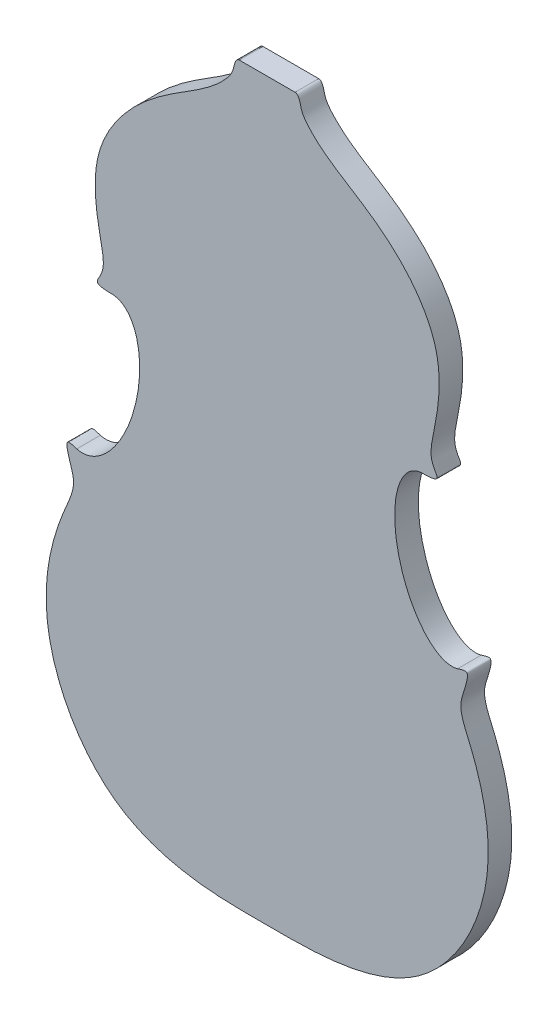
ISO-10303-21;
HEADER;
FILE_DESCRIPTION(('STEP AP214'),'2;1');
FILE_NAME('part.step','',(''),(''),'','','');
FILE_SCHEMA(('AUTOMOTIVE_DESIGN { 1 0 10303 214 1 1 1 1 }'));
ENDSEC;
DATA;
#1=APPLICATION_CONTEXT('core data for automotive mechanical design processes');
#2=APPLICATION_PROTOCOL_DEFINITION('international standard','automotive_design',2000,#1);
#3=PRODUCT_CONTEXT('',#1,'mechanical');
#4=PRODUCT('Part','Part','',(#3));
#5=PRODUCT_RELATED_PRODUCT_CATEGORY('part','',(#4));
#6=PRODUCT_DEFINITION_FORMATION('','',#4);
#7=PRODUCT_DEFINITION_CONTEXT('part definition',#1,'design');
#8=PRODUCT_DEFINITION('design','',#6,#7);
#9=PRODUCT_DEFINITION_SHAPE('','',#8);
#10=(LENGTH_UNIT() NAMED_UNIT(*) SI_UNIT(.MILLI.,.METRE.));
#11=(NAMED_UNIT(*) PLANE_ANGLE_UNIT() SI_UNIT($,.RADIAN.));
#12=(NAMED_UNIT(*) SI_UNIT($,.STERADIAN.) SOLID_ANGLE_UNIT());
#13=UNCERTAINTY_MEASURE_WITH_UNIT(LENGTH_MEASURE(1.E-05),#10,'distance_accuracy_value','');
#14=(GEOMETRIC_REPRESENTATION_CONTEXT(3) GLOBAL_UNCERTAINTY_ASSIGNED_CONTEXT((#13)) GLOBAL_UNIT_ASSIGNED_CONTEXT((#10,
#11,#12)) REPRESENTATION_CONTEXT('',''));
#15=CARTESIAN_POINT('',(0.,0.,0.));
#16=DIRECTION('',(0.,0.,1.));
#17=DIRECTION('',(1.,0.,0.));
#18=AXIS2_PLACEMENT_3D('',#15,#16,#17);
#19=CARTESIAN_POINT('',(0.,489.229569362631,-33.528));
#20=DIRECTION('',(0.,-1.,0.));
#21=DIRECTION('',(1.,0.,0.));
#22=AXIS2_PLACEMENT_3D('',#19,#20,#21);
#23=PLANE('',#22);
#24=DIRECTION('',(1.,0.,0.));
#25=VECTOR('',#24,1.);
#26=CARTESIAN_POINT('',(0.,489.229569362631,0.));
#27=LINE('',#26,#25);
#28=CARTESIAN_POINT('',(-39.526005163562,489.229569362631,0.));
#29=VERTEX_POINT('',#28);
#30=CARTESIAN_POINT('',(39.526005163562,489.229569362631,0.));
#31=VERTEX_POINT('',#30);
#32=EDGE_CURVE('E130',#29,#31,#27,.T.);
#33=ORIENTED_EDGE('',*,*,#32,.T.);
#34=DIRECTION('',(0.,0.,1.));
#35=VECTOR('',#34,1.);
#36=CARTESIAN_POINT('',(39.526005163562,489.229569362631,-33.528));
#37=LINE('',#36,#35);
#38=CARTESIAN_POINT('',(39.526005163562,489.229569362631,-33.528));
#39=VERTEX_POINT('',#38);
#40=EDGE_CURVE('E11',#39,#31,#37,.T.);
#41=ORIENTED_EDGE('',*,*,#40,.F.);
#42=DIRECTION('',(1.,0.,0.));
#43=VECTOR('',#42,1.);
#44=CARTESIAN_POINT('',(0.,489.229569362631,-33.528));
#45=LINE('',#44,#43);
#46=CARTESIAN_POINT('',(-39.526005163562,489.229569362631,-33.528));
#47=VERTEX_POINT('',#46);
#48=EDGE_CURVE('E109',#47,#39,#45,.T.);
#49=ORIENTED_EDGE('',*,*,#48,.F.);
#50=DIRECTION('',(0.,0.,1.));
#51=VECTOR('',#50,1.);
#52=CARTESIAN_POINT('',(-39.526005163562,489.229569362631,-33.528));
#53=LINE('',#52,#51);
#54=EDGE_CURVE('E113',#47,#29,#53,.T.);
#55=ORIENTED_EDGE('',*,*,#54,.T.);
#56=EDGE_LOOP('',(#33,#41,#49,#55));
#57=FACE_BOUND('',#56,.T.);
#58=ADVANCED_FACE('F43',(#57),#23,.F.);
#59=CARTESIAN_POINT('',(39.526005163562,489.229569362631,-33.528));
#60=CARTESIAN_POINT('',(41.9941658820631,489.229569362631,-33.528));
#61=CARTESIAN_POINT('',(46.5804579159214,483.708971038662,-33.528));
#62=CARTESIAN_POINT('',(47.7623184287525,469.539805459463,-33.528));
#63=CARTESIAN_POINT('',(74.7703472572244,435.758695832475,-33.528));
#64=CARTESIAN_POINT('',(127.346779032883,407.129221149891,-33.528));
#65=CARTESIAN_POINT('',(196.147624771227,356.264111053545,-33.528));
#66=CARTESIAN_POINT('',(250.121842796438,278.719817652429,-33.528));
#67=CARTESIAN_POINT('',(243.796963910234,200.259757547331,-33.528));
#68=CARTESIAN_POINT('',(231.400647678077,148.667774360726,-33.528));
#69=CARTESIAN_POINT('',(233.206586123207,129.473919564613,-33.528));
#70=CARTESIAN_POINT('',(246.106067892617,111.456905789366,-33.528));
#71=CARTESIAN_POINT('',(223.550549609283,111.0134777671,-33.528));
#72=CARTESIAN_POINT('',(219.991214235242,111.047612515758,-33.528));
#73=B_SPLINE_CURVE_WITH_KNOTS('',3,(#59,#60,#61,#62,#63,#64,#65,#66,#67,#68,#69,#70,#71,#72),
.UNSPECIFIED.,.F.,.F.,(4,1,1,1,1,1,1,1,1,1,1,4),(0.,0.00429265755064756,0.0137125528781431,
0.0294093018634062,0.0918001280733815,0.139494610674156,0.21064263544747,0.278267170971093,
0.30068452522124,0.318441442116001,0.325161593106015,0.331714411172147),.UNSPECIFIED.);
#74=DIRECTION('',(0.,0.,1.));
#75=VECTOR('',#74,1.);
#76=SURFACE_OF_LINEAR_EXTRUSION('',#73,#75);
#77=CARTESIAN_POINT('',(39.526005163562,489.229569362631,0.));
#78=CARTESIAN_POINT('',(41.9941658820631,489.229569362631,0.));
#79=CARTESIAN_POINT('',(46.5804579159214,483.708971038662,0.));
#80=CARTESIAN_POINT('',(47.7623184287525,469.539805459463,0.));
#81=CARTESIAN_POINT('',(74.7703472572244,435.758695832475,0.));
#82=CARTESIAN_POINT('',(127.346779032883,407.129221149891,0.));
#83=CARTESIAN_POINT('',(196.147624771227,356.264111053545,0.));
#84=CARTESIAN_POINT('',(250.121842796438,278.719817652429,0.));
#85=CARTESIAN_POINT('',(243.796963910234,200.259757547331,0.));
#86=CARTESIAN_POINT('',(231.400647678077,148.667774360726,0.));
#87=CARTESIAN_POINT('',(233.206586123207,129.473919564613,0.));
#88=CARTESIAN_POINT('',(246.106067892617,111.456905789366,0.));
#89=CARTESIAN_POINT('',(223.550549609283,111.0134777671,0.));
#90=CARTESIAN_POINT('',(219.991214235242,111.047612515758,0.));
#91=B_SPLINE_CURVE_WITH_KNOTS('',3,(#77,#78,#79,#80,#81,#82,#83,#84,#85,#86,#87,#88,#89,#90),
.UNSPECIFIED.,.F.,.F.,(4,1,1,1,1,1,1,1,1,1,1,4),(0.,0.00429265755064756,0.0137125528781431,
0.0294093018634062,0.0918001280733815,0.139494610674156,0.21064263544747,0.278267170971093,
0.30068452522124,0.318441442116001,0.325161593106015,0.331714411172147),.UNSPECIFIED.);
#92=CARTESIAN_POINT('',(219.991214235242,111.047612515758,0.));
#93=VERTEX_POINT('',#92);
#94=EDGE_CURVE('E133',#31,#93,#91,.T.);
#95=ORIENTED_EDGE('',*,*,#94,.T.);
#96=DIRECTION('',(0.,0.,1.));
#97=VECTOR('',#96,1.);
#98=CARTESIAN_POINT('',(219.991214235242,111.047612515758,-33.528));
#99=LINE('',#98,#97);
#100=CARTESIAN_POINT('',(219.991214235242,111.047612515758,-33.528));
#101=VERTEX_POINT('',#100);
#102=EDGE_CURVE('E51',#101,#93,#99,.T.);
#103=ORIENTED_EDGE('',*,*,#102,.F.);
#104=EDGE_CURVE('E86',#39,#101,#73,.T.);
#105=ORIENTED_EDGE('',*,*,#104,.F.);
#106=ORIENTED_EDGE('',*,*,#40,.T.);
#107=EDGE_LOOP('',(#95,#103,#105,#106));
#108=FACE_BOUND('',#107,.T.);
#109=ADVANCED_FACE('F149',(#108),#76,.F.);
#110=CARTESIAN_POINT('',(241.73025503747,2.81505036796842,-33.528));
#111=DIRECTION('',(0.,0.,-1.));
#112=DIRECTION('',(-0.251612563696359,0.967828041436156,0.));
#113=AXIS2_PLACEMENT_3D('',#110,#111,#112);
#114=ELLIPSE('',#113,110.90870221918,55.671349069712);
#115=DIRECTION('',(0.,0.,1.));
#116=VECTOR('',#115,1.);
#117=SURFACE_OF_LINEAR_EXTRUSION('',#114,#116);
#118=CARTESIAN_POINT('',(241.73025503747,2.81505036796842,0.));
#119=DIRECTION('',(0.,0.,-1.));
#120=DIRECTION('',(-0.251612563696359,0.967828041436156,0.));
#121=AXIS2_PLACEMENT_3D('',#118,#119,#120);
#122=ELLIPSE('',#121,110.90870221918,55.671349069712);
#123=CARTESIAN_POINT('',(270.371015495863,-104.323756020458,0.));
#124=VERTEX_POINT('',#123);
#125=EDGE_CURVE('E170',#124,#93,#122,.T.);
#126=ORIENTED_EDGE('',*,*,#125,.F.);
#127=DIRECTION('',(0.,0.,1.));
#128=VECTOR('',#127,1.);
#129=CARTESIAN_POINT('',(270.371015495863,-104.323756020458,-33.528));
#130=LINE('',#129,#128);
#131=CARTESIAN_POINT('',(270.371015495863,-104.323756020458,-33.528));
#132=VERTEX_POINT('',#131);
#133=EDGE_CURVE('E80',#132,#124,#130,.T.);
#134=ORIENTED_EDGE('',*,*,#133,.F.);
#135=EDGE_CURVE('E143',#132,#101,#114,.T.);
#136=ORIENTED_EDGE('',*,*,#135,.T.);
#137=ORIENTED_EDGE('',*,*,#102,.T.);
#138=EDGE_LOOP('',(#126,#134,#136,#137));
#139=FACE_BOUND('',#138,.T.);
#140=ADVANCED_FACE('F152',(#139),#117,.T.);
#141=CARTESIAN_POINT('',(270.371015495863,-104.323756020459,-33.528));
#142=CARTESIAN_POINT('',(281.787258306747,-100.433002014907,-33.528));
#143=CARTESIAN_POINT('',(286.665344413552,-102.974391332354,-33.528));
#144=CARTESIAN_POINT('',(280.053446734253,-125.94820853805,-33.528));
#145=CARTESIAN_POINT('',(270.840593781677,-151.662507255342,-33.528));
#146=CARTESIAN_POINT('',(307.762242936497,-226.693334601356,-33.528));
#147=CARTESIAN_POINT('',(330.768683107291,-359.325942549207,-33.528));
#148=CARTESIAN_POINT('',(234.516639482928,-526.575397488439,-33.528));
#149=CARTESIAN_POINT('',(103.980282593174,-554.029663016559,-33.528));
#150=CARTESIAN_POINT('',(29.314144200887,-555.029340186396,-33.528));
#151=CARTESIAN_POINT('',(6.95388456085303,-554.967468443146,-33.528));
#152=CARTESIAN_POINT('',(0.,-554.967468443146,-33.528));
#153=B_SPLINE_CURVE_WITH_KNOTS('',3,(#141,#142,#143,#144,#145,#146,#147,#148,#149,#150,#151,
#152),.UNSPECIFIED.,.F.,.F.,(4,1,1,1,1,1,1,1,1,4),(0.531515794392163,0.541192241769011,
0.555870224037018,0.57020962267613,0.600541867521211,0.716993045402029,0.849100379554623,
0.951451168373762,0.984334691964348,1.),.UNSPECIFIED.);
#154=DIRECTION('',(0.,0.,1.));
#155=VECTOR('',#154,1.);
#156=SURFACE_OF_LINEAR_EXTRUSION('',#153,#155);
#157=CARTESIAN_POINT('',(270.371015495863,-104.323756020459,0.));
#158=CARTESIAN_POINT('',(281.787258306747,-100.433002014907,0.));
#159=CARTESIAN_POINT('',(286.665344413552,-102.974391332354,0.));
#160=CARTESIAN_POINT('',(280.053446734253,-125.94820853805,0.));
#161=CARTESIAN_POINT('',(270.840593781677,-151.662507255342,0.));
#162=CARTESIAN_POINT('',(307.762242936497,-226.693334601356,0.));
#163=CARTESIAN_POINT('',(330.768683107291,-359.325942549207,0.));
#164=CARTESIAN_POINT('',(234.516639482928,-526.575397488439,0.));
#165=CARTESIAN_POINT('',(103.980282593174,-554.029663016559,0.));
#166=CARTESIAN_POINT('',(29.314144200887,-555.029340186396,0.));
#167=CARTESIAN_POINT('',(6.95388456085303,-554.967468443146,0.));
#168=CARTESIAN_POINT('',(0.,-554.967468443146,0.));
#169=B_SPLINE_CURVE_WITH_KNOTS('',3,(#157,#158,#159,#160,#161,#162,#163,#164,#165,#166,#167,
#168),.UNSPECIFIED.,.F.,.F.,(4,1,1,1,1,1,1,1,1,4),(0.531515794392163,0.541192241769011,
0.555870224037018,0.57020962267613,0.600541867521211,0.716993045402029,0.849100379554623,
0.951451168373762,0.984334691964348,1.),.UNSPECIFIED.);
#170=CARTESIAN_POINT('',(0.,-554.967468443146,0.));
#171=VERTEX_POINT('',#170);
#172=EDGE_CURVE('E114',#124,#171,#169,.T.);
#173=ORIENTED_EDGE('',*,*,#172,.T.);
#174=DIRECTION('',(0.,0.,1.));
#175=VECTOR('',#174,1.);
#176=CARTESIAN_POINT('',(0.,-554.967468443146,-33.528));
#177=LINE('',#176,#175);
#178=CARTESIAN_POINT('',(0.,-554.967468443146,-33.528));
#179=VERTEX_POINT('',#178);
#180=EDGE_CURVE('E183',#179,#171,#177,.T.);
#181=ORIENTED_EDGE('',*,*,#180,.F.);
#182=EDGE_CURVE('E59',#132,#179,#153,.T.);
#183=ORIENTED_EDGE('',*,*,#182,.F.);
#184=ORIENTED_EDGE('',*,*,#133,.T.);
#185=EDGE_LOOP('',(#173,#181,#183,#184));
#186=FACE_BOUND('',#185,.T.);
#187=ADVANCED_FACE('F155',(#186),#156,.F.);
#188=CARTESIAN_POINT('',(210.683482625052,331.560145682091,-33.528));
#189=DIRECTION('',(0.,0.,1.));
#190=DIRECTION('',(1.,0.,0.));
#191=AXIS2_PLACEMENT_3D('',#188,#189,#190);
#192=PLANE('',#191);
#193=ORIENTED_EDGE('',*,*,#48,.T.);
#194=ORIENTED_EDGE('',*,*,#104,.T.);
#195=ORIENTED_EDGE('',*,*,#135,.F.);
#196=ORIENTED_EDGE('',*,*,#182,.T.);
#197=CARTESIAN_POINT('',(-270.371015495863,-104.323756020459,-33.528));
#198=CARTESIAN_POINT('',(-281.787258306747,-100.433002014907,-33.528));
#199=CARTESIAN_POINT('',(-286.665344413552,-102.974391332354,-33.528));
#200=CARTESIAN_POINT('',(-280.053446734253,-125.94820853805,-33.528));
#201=CARTESIAN_POINT('',(-270.840593781677,-151.662507255342,-33.528));
#202=CARTESIAN_POINT('',(-307.762242936497,-226.693334601356,-33.528));
#203=CARTESIAN_POINT('',(-330.768683107291,-359.325942549207,-33.528));
#204=CARTESIAN_POINT('',(-234.516639482928,-526.575397488439,-33.528));
#205=CARTESIAN_POINT('',(-103.980282593174,-554.029663016559,-33.528));
#206=CARTESIAN_POINT('',(-29.314144200887,-555.029340186396,-33.528));
#207=CARTESIAN_POINT('',(-6.95388456085303,-554.967468443146,-33.528));
#208=CARTESIAN_POINT('',(0.,-554.967468443146,-33.528));
#209=B_SPLINE_CURVE_WITH_KNOTS('',3,(#197,#198,#199,#200,#201,#202,#203,#204,#205,#206,#207,
#208),.UNSPECIFIED.,.F.,.F.,(4,1,1,1,1,1,1,1,1,4),(0.531515794392163,0.541192241769011,
0.555870224037018,0.57020962267613,0.600541867521211,0.716993045402029,0.849100379554623,
0.951451168373762,0.984334691964348,1.),.UNSPECIFIED.);
#210=CARTESIAN_POINT('',(-270.371015495863,-104.323756020458,-33.528));
#211=VERTEX_POINT('',#210);
#212=EDGE_CURVE('E191',#211,#179,#209,.T.);
#213=ORIENTED_EDGE('',*,*,#212,.F.);
#214=CARTESIAN_POINT('',(-241.73025503747,2.81505036796842,-33.528));
#215=DIRECTION('',(0.,0.,1.));
#216=DIRECTION('',(0.251612563696359,0.967828041436156,0.));
#217=AXIS2_PLACEMENT_3D('',#214,#215,#216);
#218=ELLIPSE('',#217,110.90870221918,55.671349069712);
#219=CARTESIAN_POINT('',(-219.991214235242,111.047612515758,-33.528));
#220=VERTEX_POINT('',#219);
#221=EDGE_CURVE('E120',#211,#220,#218,.T.);
#222=ORIENTED_EDGE('',*,*,#221,.T.);
#223=CARTESIAN_POINT('',(-39.526005163562,489.229569362631,-33.528));
#224=CARTESIAN_POINT('',(-41.9941658820631,489.229569362631,-33.528));
#225=CARTESIAN_POINT('',(-46.5804579159214,483.708971038662,-33.528));
#226=CARTESIAN_POINT('',(-47.7623184287525,469.539805459463,-33.528));
#227=CARTESIAN_POINT('',(-74.7703472572244,435.758695832475,-33.528));
#228=CARTESIAN_POINT('',(-127.346779032883,407.129221149891,-33.528));
#229=CARTESIAN_POINT('',(-196.147624771227,356.264111053545,-33.528));
#230=CARTESIAN_POINT('',(-250.121842796438,278.719817652429,-33.528));
#231=CARTESIAN_POINT('',(-243.796963910234,200.259757547331,-33.528));
#232=CARTESIAN_POINT('',(-231.400647678077,148.667774360726,-33.528));
#233=CARTESIAN_POINT('',(-233.206586123207,129.473919564613,-33.528));
#234=CARTESIAN_POINT('',(-246.106067892617,111.456905789366,-33.528));
#235=CARTESIAN_POINT('',(-223.550549609283,111.0134777671,-33.528));
#236=CARTESIAN_POINT('',(-219.991214235242,111.047612515758,-33.528));
#237=B_SPLINE_CURVE_WITH_KNOTS('',3,(#223,#224,#225,#226,#227,#228,#229,#230,#231,#232,#233,
#234,#235,#236),.UNSPECIFIED.,.F.,.F.,(4,1,1,1,1,1,1,1,1,1,1,4),(0.,0.00429265755064756,
0.0137125528781431,0.0294093018634062,0.0918001280733815,0.139494610674156,0.21064263544747,
0.278267170971093,0.30068452522124,0.318441442116001,0.325161593106015,0.331714411172147),.UNSPECIFIED.);
#238=EDGE_CURVE('E117',#47,#220,#237,.T.);
#239=ORIENTED_EDGE('',*,*,#238,.F.);
#240=EDGE_LOOP('',(#193,#194,#195,#196,#213,#222,#239));
#241=FACE_BOUND('',#240,.T.);
#242=ADVANCED_FACE('F118',(#241),#192,.F.);
#243=CARTESIAN_POINT('',(210.683482625052,331.560145682091,0.));
#244=DIRECTION('',(0.,0.,1.));
#245=DIRECTION('',(1.,0.,0.));
#246=AXIS2_PLACEMENT_3D('',#243,#244,#245);
#247=PLANE('',#246);
#248=ORIENTED_EDGE('',*,*,#32,.F.);
#249=CARTESIAN_POINT('',(-39.526005163562,489.229569362631,0.));
#250=CARTESIAN_POINT('',(-41.9941658820631,489.229569362631,0.));
#251=CARTESIAN_POINT('',(-46.5804579159214,483.708971038662,0.));
#252=CARTESIAN_POINT('',(-47.7623184287525,469.539805459463,0.));
#253=CARTESIAN_POINT('',(-74.7703472572244,435.758695832475,0.));
#254=CARTESIAN_POINT('',(-127.346779032883,407.129221149891,0.));
#255=CARTESIAN_POINT('',(-196.147624771227,356.264111053545,0.));
#256=CARTESIAN_POINT('',(-250.121842796438,278.719817652429,0.));
#257=CARTESIAN_POINT('',(-243.796963910234,200.259757547331,0.));
#258=CARTESIAN_POINT('',(-231.400647678077,148.667774360726,0.));
#259=CARTESIAN_POINT('',(-233.206586123207,129.473919564613,0.));
#260=CARTESIAN_POINT('',(-246.106067892617,111.456905789366,0.));
#261=CARTESIAN_POINT('',(-223.550549609283,111.0134777671,0.));
#262=CARTESIAN_POINT('',(-219.991214235242,111.047612515758,0.));
#263=B_SPLINE_CURVE_WITH_KNOTS('',3,(#249,#250,#251,#252,#253,#254,#255,#256,#257,#258,#259,
#260,#261,#262),.UNSPECIFIED.,.F.,.F.,(4,1,1,1,1,1,1,1,1,1,1,4),(0.,0.00429265755064756,
0.0137125528781431,0.0294093018634062,0.0918001280733815,0.139494610674156,0.21064263544747,
0.278267170971093,0.30068452522124,0.318441442116001,0.325161593106015,0.331714411172147),.UNSPECIFIED.);
#264=CARTESIAN_POINT('',(-219.991214235242,111.047612515758,0.));
#265=VERTEX_POINT('',#264);
#266=EDGE_CURVE('E129',#29,#265,#263,.T.);
#267=ORIENTED_EDGE('',*,*,#266,.T.);
#268=CARTESIAN_POINT('',(-241.73025503747,2.81505036796842,0.));
#269=DIRECTION('',(0.,0.,1.));
#270=DIRECTION('',(0.251612563696359,0.967828041436156,0.));
#271=AXIS2_PLACEMENT_3D('',#268,#269,#270);
#272=ELLIPSE('',#271,110.90870221918,55.671349069712);
#273=CARTESIAN_POINT('',(-270.371015495863,-104.323756020458,0.));
#274=VERTEX_POINT('',#273);
#275=EDGE_CURVE('E194',#274,#265,#272,.T.);
#276=ORIENTED_EDGE('',*,*,#275,.F.);
#277=CARTESIAN_POINT('',(-270.371015495863,-104.323756020459,0.));
#278=CARTESIAN_POINT('',(-281.787258306747,-100.433002014907,0.));
#279=CARTESIAN_POINT('',(-286.665344413552,-102.974391332354,0.));
#280=CARTESIAN_POINT('',(-280.053446734253,-125.94820853805,0.));
#281=CARTESIAN_POINT('',(-270.840593781677,-151.662507255342,0.));
#282=CARTESIAN_POINT('',(-307.762242936497,-226.693334601356,0.));
#283=CARTESIAN_POINT('',(-330.768683107291,-359.325942549207,0.));
#284=CARTESIAN_POINT('',(-234.516639482928,-526.575397488439,0.));
#285=CARTESIAN_POINT('',(-103.980282593174,-554.029663016559,0.));
#286=CARTESIAN_POINT('',(-29.314144200887,-555.029340186396,0.));
#287=CARTESIAN_POINT('',(-6.95388456085303,-554.967468443146,0.));
#288=CARTESIAN_POINT('',(0.,-554.967468443146,0.));
#289=B_SPLINE_CURVE_WITH_KNOTS('',3,(#277,#278,#279,#280,#281,#282,#283,#284,#285,#286,#287,
#288),.UNSPECIFIED.,.F.,.F.,(4,1,1,1,1,1,1,1,1,4),(0.531515794392163,0.541192241769011,
0.555870224037018,0.57020962267613,0.600541867521211,0.716993045402029,0.849100379554623,
0.951451168373762,0.984334691964348,1.),.UNSPECIFIED.);
#290=EDGE_CURVE('E124',#274,#171,#289,.T.);
#291=ORIENTED_EDGE('',*,*,#290,.T.);
#292=ORIENTED_EDGE('',*,*,#172,.F.);
#293=ORIENTED_EDGE('',*,*,#125,.T.);
#294=ORIENTED_EDGE('',*,*,#94,.F.);
#295=EDGE_LOOP('',(#248,#267,#276,#291,#292,#293,#294));
#296=FACE_BOUND('',#295,.T.);
#297=ADVANCED_FACE('F158',(#296),#247,.T.);
#298=DIRECTION('',(0.,0.,1.));
#299=VECTOR('',#298,1.);
#300=SURFACE_OF_LINEAR_EXTRUSION('',#237,#299);
#301=ORIENTED_EDGE('',*,*,#266,.F.);
#302=ORIENTED_EDGE('',*,*,#54,.F.);
#303=ORIENTED_EDGE('',*,*,#238,.T.);
#304=DIRECTION('',(0.,0.,1.));
#305=VECTOR('',#304,1.);
#306=CARTESIAN_POINT('',(-219.991214235242,111.047612515758,-33.528));
#307=LINE('',#306,#305);
#308=EDGE_CURVE('E131',#220,#265,#307,.T.);
#309=ORIENTED_EDGE('',*,*,#308,.T.);
#310=EDGE_LOOP('',(#301,#302,#303,#309));
#311=FACE_BOUND('',#310,.T.);
#312=ADVANCED_FACE('F127',(#311),#300,.T.);
#313=DIRECTION('',(0.,0.,1.));
#314=VECTOR('',#313,1.);
#315=SURFACE_OF_LINEAR_EXTRUSION('',#218,#314);
#316=ORIENTED_EDGE('',*,*,#275,.T.);
#317=ORIENTED_EDGE('',*,*,#308,.F.);
#318=ORIENTED_EDGE('',*,*,#221,.F.);
#319=DIRECTION('',(0.,0.,1.));
#320=VECTOR('',#319,1.);
#321=CARTESIAN_POINT('',(-270.371015495863,-104.323756020458,-33.528));
#322=LINE('',#321,#320);
#323=EDGE_CURVE('E135',#211,#274,#322,.T.);
#324=ORIENTED_EDGE('',*,*,#323,.T.);
#325=EDGE_LOOP('',(#316,#317,#318,#324));
#326=FACE_BOUND('',#325,.T.);
#327=ADVANCED_FACE('F204',(#326),#315,.F.);
#328=DIRECTION('',(0.,0.,1.));
#329=VECTOR('',#328,1.);
#330=SURFACE_OF_LINEAR_EXTRUSION('',#209,#329);
#331=ORIENTED_EDGE('',*,*,#290,.F.);
#332=ORIENTED_EDGE('',*,*,#323,.F.);
#333=ORIENTED_EDGE('',*,*,#212,.T.);
#334=ORIENTED_EDGE('',*,*,#180,.T.);
#335=EDGE_LOOP('',(#331,#332,#333,#334));
#336=FACE_BOUND('',#335,.T.);
#337=ADVANCED_FACE('F188',(#336),#330,.T.);
#338=CLOSED_SHELL('',(#58,#109,#140,#187,#242,#297,#312,#327,#337));
#339=MANIFOLD_SOLID_BREP('B2',#338);
#340=ADVANCED_BREP_SHAPE_REPRESENTATION('',(#18,#339),#14);
#341=SHAPE_DEFINITION_REPRESENTATION(#9,#340);
ENDSEC;
END-ISO-10303-21;
